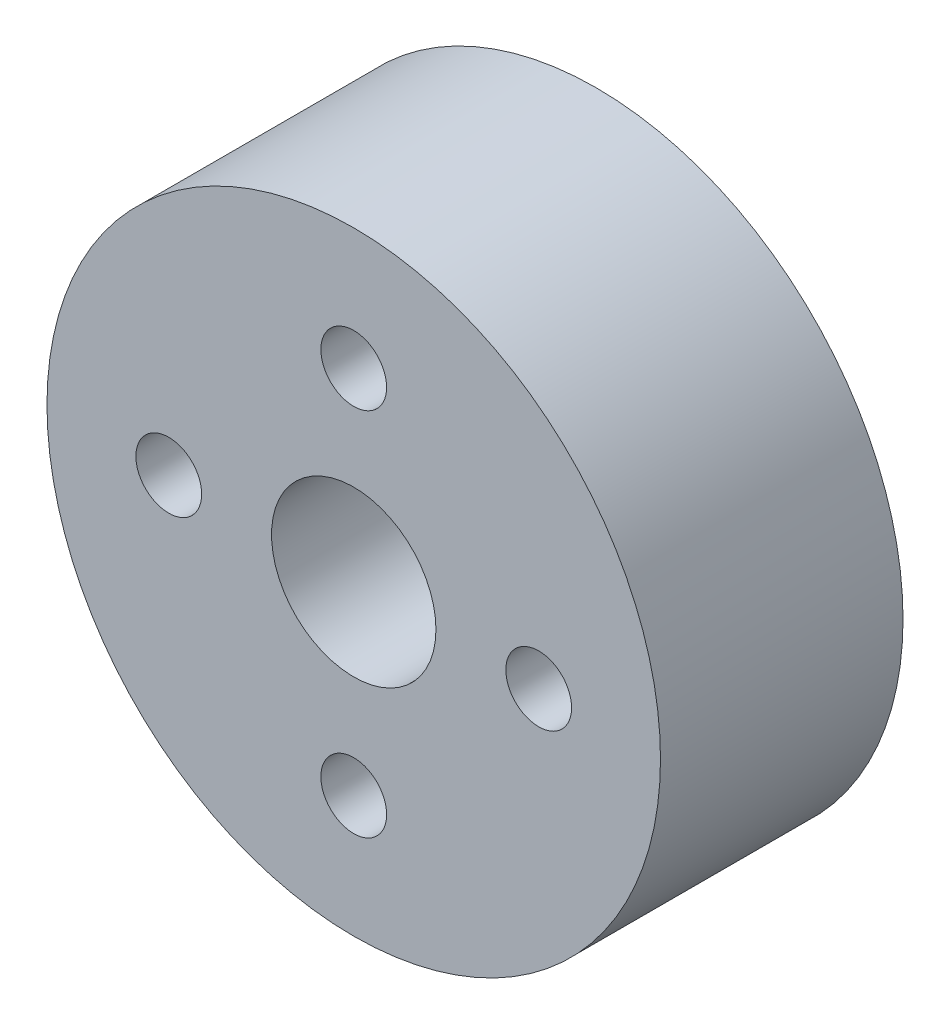
ISO-10303-21;
HEADER;
FILE_DESCRIPTION(('STEP AP214'),'2;1');
FILE_NAME('part.step','',(''),(''),'','','');
FILE_SCHEMA(('AUTOMOTIVE_DESIGN { 1 0 10303 214 1 1 1 1 }'));
ENDSEC;
DATA;
#1=APPLICATION_CONTEXT('core data for automotive mechanical design processes');
#2=APPLICATION_PROTOCOL_DEFINITION('international standard','automotive_design',2000,#1);
#3=PRODUCT_CONTEXT('',#1,'mechanical');
#4=PRODUCT('Part','Part','',(#3));
#5=PRODUCT_RELATED_PRODUCT_CATEGORY('part','',(#4));
#6=PRODUCT_DEFINITION_FORMATION('','',#4);
#7=PRODUCT_DEFINITION_CONTEXT('part definition',#1,'design');
#8=PRODUCT_DEFINITION('design','',#6,#7);
#9=PRODUCT_DEFINITION_SHAPE('','',#8);
#10=(LENGTH_UNIT() NAMED_UNIT(*) SI_UNIT(.MILLI.,.METRE.));
#11=(NAMED_UNIT(*) PLANE_ANGLE_UNIT() SI_UNIT($,.RADIAN.));
#12=(NAMED_UNIT(*) SI_UNIT($,.STERADIAN.) SOLID_ANGLE_UNIT());
#13=UNCERTAINTY_MEASURE_WITH_UNIT(LENGTH_MEASURE(1.E-05),#10,'distance_accuracy_value','');
#14=(GEOMETRIC_REPRESENTATION_CONTEXT(3) GLOBAL_UNCERTAINTY_ASSIGNED_CONTEXT((#13)) GLOBAL_UNIT_ASSIGNED_CONTEXT((#10,
#11,#12)) REPRESENTATION_CONTEXT('',''));
#15=CARTESIAN_POINT('',(0.,0.,0.));
#16=DIRECTION('',(0.,0.,1.));
#17=DIRECTION('',(1.,0.,0.));
#18=AXIS2_PLACEMENT_3D('',#15,#16,#17);
#19=CARTESIAN_POINT('',(0.,0.,11.8));
#20=DIRECTION('',(0.,0.,1.));
#21=DIRECTION('',(1.,0.,0.));
#22=AXIS2_PLACEMENT_3D('',#19,#20,#21);
#23=PLANE('',#22);
#24=CARTESIAN_POINT('',(0.,9.,11.8));
#25=DIRECTION('',(0.,0.,1.));
#26=DIRECTION('',(1.,0.,0.));
#27=AXIS2_PLACEMENT_3D('',#24,#25,#26);
#28=CIRCLE('',#27,1.6);
#29=CARTESIAN_POINT('',(1.6,9.,11.8));
#30=VERTEX_POINT('',#29);
#31=EDGE_CURVE('E67',#30,#30,#28,.T.);
#32=ORIENTED_EDGE('',*,*,#31,.F.);
#33=EDGE_LOOP('',(#32));
#34=FACE_BOUND('',#33,.T.);
#35=CARTESIAN_POINT('',(-9.,0.,11.8));
#36=DIRECTION('',(0.,0.,1.));
#37=DIRECTION('',(1.,0.,0.));
#38=AXIS2_PLACEMENT_3D('',#35,#36,#37);
#39=CIRCLE('',#38,1.6);
#40=CARTESIAN_POINT('',(-7.4,0.,11.8));
#41=VERTEX_POINT('',#40);
#42=EDGE_CURVE('E55',#41,#41,#39,.T.);
#43=ORIENTED_EDGE('',*,*,#42,.F.);
#44=EDGE_LOOP('',(#43));
#45=FACE_BOUND('',#44,.T.);
#46=CARTESIAN_POINT('',(0.,0.,11.8));
#47=DIRECTION('',(0.,0.,1.));
#48=DIRECTION('',(1.,0.,0.));
#49=AXIS2_PLACEMENT_3D('',#46,#47,#48);
#50=CIRCLE('',#49,14.925);
#51=CARTESIAN_POINT('',(14.925,0.,11.8));
#52=VERTEX_POINT('',#51);
#53=EDGE_CURVE('E10',#52,#52,#50,.T.);
#54=ORIENTED_EDGE('',*,*,#53,.T.);
#55=EDGE_LOOP('',(#54));
#56=FACE_BOUND('',#55,.T.);
#57=CARTESIAN_POINT('',(0.,0.,11.8));
#58=DIRECTION('',(0.,0.,1.));
#59=DIRECTION('',(1.,0.,0.));
#60=AXIS2_PLACEMENT_3D('',#57,#58,#59);
#61=CIRCLE('',#60,4.);
#62=CARTESIAN_POINT('',(4.,0.,11.8));
#63=VERTEX_POINT('',#62);
#64=EDGE_CURVE('E50',#63,#63,#61,.T.);
#65=ORIENTED_EDGE('',*,*,#64,.F.);
#66=EDGE_LOOP('',(#65));
#67=FACE_BOUND('',#66,.T.);
#68=CARTESIAN_POINT('',(9.,0.,11.8));
#69=DIRECTION('',(0.,0.,1.));
#70=DIRECTION('',(1.,0.,0.));
#71=AXIS2_PLACEMENT_3D('',#68,#69,#70);
#72=CIRCLE('',#71,1.6);
#73=CARTESIAN_POINT('',(10.6,0.,11.8));
#74=VERTEX_POINT('',#73);
#75=EDGE_CURVE('E61',#74,#74,#72,.T.);
#76=ORIENTED_EDGE('',*,*,#75,.F.);
#77=EDGE_LOOP('',(#76));
#78=FACE_BOUND('',#77,.T.);
#79=CARTESIAN_POINT('',(0.,-9.,11.8));
#80=DIRECTION('',(0.,0.,1.));
#81=DIRECTION('',(1.,0.,0.));
#82=AXIS2_PLACEMENT_3D('',#79,#80,#81);
#83=CIRCLE('',#82,1.6);
#84=CARTESIAN_POINT('',(1.6,-9.,11.8));
#85=VERTEX_POINT('',#84);
#86=EDGE_CURVE('E73',#85,#85,#83,.T.);
#87=ORIENTED_EDGE('',*,*,#86,.F.);
#88=EDGE_LOOP('',(#87));
#89=FACE_BOUND('',#88,.T.);
#90=ADVANCED_FACE('F39',(#34,#45,#56,#67,#78,#89),#23,.T.);
#91=CARTESIAN_POINT('',(0.,0.,0.));
#92=DIRECTION('',(0.,0.,1.));
#93=DIRECTION('',(1.,0.,0.));
#94=AXIS2_PLACEMENT_3D('',#91,#92,#93);
#95=PLANE('',#94);
#96=CARTESIAN_POINT('',(0.,0.,0.));
#97=DIRECTION('',(0.,0.,1.));
#98=DIRECTION('',(1.,0.,0.));
#99=AXIS2_PLACEMENT_3D('',#96,#97,#98);
#100=CIRCLE('',#99,14.925);
#101=CARTESIAN_POINT('',(14.925,0.,0.));
#102=VERTEX_POINT('',#101);
#103=EDGE_CURVE('E43',#102,#102,#100,.T.);
#104=ORIENTED_EDGE('',*,*,#103,.F.);
#105=EDGE_LOOP('',(#104));
#106=FACE_BOUND('',#105,.T.);
#107=CARTESIAN_POINT('',(0.,0.,0.));
#108=DIRECTION('',(0.,0.,1.));
#109=DIRECTION('',(1.,0.,0.));
#110=AXIS2_PLACEMENT_3D('',#107,#108,#109);
#111=CIRCLE('',#110,4.);
#112=CARTESIAN_POINT('',(4.,0.,0.));
#113=VERTEX_POINT('',#112);
#114=EDGE_CURVE('E52',#113,#113,#111,.T.);
#115=ORIENTED_EDGE('',*,*,#114,.T.);
#116=EDGE_LOOP('',(#115));
#117=FACE_BOUND('',#116,.T.);
#118=CARTESIAN_POINT('',(-9.,0.,0.));
#119=DIRECTION('',(0.,0.,1.));
#120=DIRECTION('',(1.,0.,0.));
#121=AXIS2_PLACEMENT_3D('',#118,#119,#120);
#122=CIRCLE('',#121,1.6);
#123=CARTESIAN_POINT('',(-7.4,0.,0.));
#124=VERTEX_POINT('',#123);
#125=EDGE_CURVE('E58',#124,#124,#122,.T.);
#126=ORIENTED_EDGE('',*,*,#125,.T.);
#127=EDGE_LOOP('',(#126));
#128=FACE_BOUND('',#127,.T.);
#129=CARTESIAN_POINT('',(9.,0.,0.));
#130=DIRECTION('',(0.,0.,1.));
#131=DIRECTION('',(1.,0.,0.));
#132=AXIS2_PLACEMENT_3D('',#129,#130,#131);
#133=CIRCLE('',#132,1.6);
#134=CARTESIAN_POINT('',(10.6,0.,0.));
#135=VERTEX_POINT('',#134);
#136=EDGE_CURVE('E64',#135,#135,#133,.T.);
#137=ORIENTED_EDGE('',*,*,#136,.T.);
#138=EDGE_LOOP('',(#137));
#139=FACE_BOUND('',#138,.T.);
#140=CARTESIAN_POINT('',(0.,9.,0.));
#141=DIRECTION('',(0.,0.,1.));
#142=DIRECTION('',(1.,0.,0.));
#143=AXIS2_PLACEMENT_3D('',#140,#141,#142);
#144=CIRCLE('',#143,1.6);
#145=CARTESIAN_POINT('',(1.6,9.,0.));
#146=VERTEX_POINT('',#145);
#147=EDGE_CURVE('E70',#146,#146,#144,.T.);
#148=ORIENTED_EDGE('',*,*,#147,.T.);
#149=EDGE_LOOP('',(#148));
#150=FACE_BOUND('',#149,.T.);
#151=CARTESIAN_POINT('',(0.,-9.,0.));
#152=DIRECTION('',(0.,0.,1.));
#153=DIRECTION('',(1.,0.,0.));
#154=AXIS2_PLACEMENT_3D('',#151,#152,#153);
#155=CIRCLE('',#154,1.6);
#156=CARTESIAN_POINT('',(1.6,-9.,0.));
#157=VERTEX_POINT('',#156);
#158=EDGE_CURVE('E76',#157,#157,#155,.T.);
#159=ORIENTED_EDGE('',*,*,#158,.T.);
#160=EDGE_LOOP('',(#159));
#161=FACE_BOUND('',#160,.T.);
#162=ADVANCED_FACE('F86',(#106,#117,#128,#139,#150,#161),#95,.F.);
#163=CARTESIAN_POINT('',(0.,0.,11.8));
#164=DIRECTION('',(0.,0.,-1.));
#165=DIRECTION('',(-1.,0.,0.));
#166=AXIS2_PLACEMENT_3D('',#163,#164,#165);
#167=CYLINDRICAL_SURFACE('',#166,14.925);
#168=ORIENTED_EDGE('',*,*,#53,.F.);
#169=EDGE_LOOP('',(#168));
#170=FACE_BOUND('',#169,.T.);
#171=ORIENTED_EDGE('',*,*,#103,.T.);
#172=EDGE_LOOP('',(#171));
#173=FACE_BOUND('',#172,.T.);
#174=ADVANCED_FACE('F41',(#170,#173),#167,.T.);
#175=CARTESIAN_POINT('',(0.,0.,11.8));
#176=DIRECTION('',(0.,0.,-1.));
#177=DIRECTION('',(-1.,0.,0.));
#178=AXIS2_PLACEMENT_3D('',#175,#176,#177);
#179=CYLINDRICAL_SURFACE('',#178,4.);
#180=ORIENTED_EDGE('',*,*,#64,.T.);
#181=EDGE_LOOP('',(#180));
#182=FACE_BOUND('',#181,.T.);
#183=ORIENTED_EDGE('',*,*,#114,.F.);
#184=EDGE_LOOP('',(#183));
#185=FACE_BOUND('',#184,.T.);
#186=ADVANCED_FACE('F96',(#182,#185),#179,.F.);
#187=CARTESIAN_POINT('',(-9.,0.,11.8));
#188=DIRECTION('',(0.,0.,-1.));
#189=DIRECTION('',(-1.,0.,0.));
#190=AXIS2_PLACEMENT_3D('',#187,#188,#189);
#191=CYLINDRICAL_SURFACE('',#190,1.6);
#192=ORIENTED_EDGE('',*,*,#42,.T.);
#193=EDGE_LOOP('',(#192));
#194=FACE_BOUND('',#193,.T.);
#195=ORIENTED_EDGE('',*,*,#125,.F.);
#196=EDGE_LOOP('',(#195));
#197=FACE_BOUND('',#196,.T.);
#198=ADVANCED_FACE('F99',(#194,#197),#191,.F.);
#199=CARTESIAN_POINT('',(9.,0.,11.8));
#200=DIRECTION('',(0.,0.,-1.));
#201=DIRECTION('',(-1.,0.,0.));
#202=AXIS2_PLACEMENT_3D('',#199,#200,#201);
#203=CYLINDRICAL_SURFACE('',#202,1.6);
#204=ORIENTED_EDGE('',*,*,#75,.T.);
#205=EDGE_LOOP('',(#204));
#206=FACE_BOUND('',#205,.T.);
#207=ORIENTED_EDGE('',*,*,#136,.F.);
#208=EDGE_LOOP('',(#207));
#209=FACE_BOUND('',#208,.T.);
#210=ADVANCED_FACE('F103',(#206,#209),#203,.F.);
#211=CARTESIAN_POINT('',(0.,9.,11.8));
#212=DIRECTION('',(0.,0.,-1.));
#213=DIRECTION('',(-1.,0.,0.));
#214=AXIS2_PLACEMENT_3D('',#211,#212,#213);
#215=CYLINDRICAL_SURFACE('',#214,1.6);
#216=ORIENTED_EDGE('',*,*,#31,.T.);
#217=EDGE_LOOP('',(#216));
#218=FACE_BOUND('',#217,.T.);
#219=ORIENTED_EDGE('',*,*,#147,.F.);
#220=EDGE_LOOP('',(#219));
#221=FACE_BOUND('',#220,.T.);
#222=ADVANCED_FACE('F107',(#218,#221),#215,.F.);
#223=CARTESIAN_POINT('',(0.,-9.,11.8));
#224=DIRECTION('',(0.,0.,-1.));
#225=DIRECTION('',(-1.,0.,0.));
#226=AXIS2_PLACEMENT_3D('',#223,#224,#225);
#227=CYLINDRICAL_SURFACE('',#226,1.6);
#228=ORIENTED_EDGE('',*,*,#86,.T.);
#229=EDGE_LOOP('',(#228));
#230=FACE_BOUND('',#229,.T.);
#231=ORIENTED_EDGE('',*,*,#158,.F.);
#232=EDGE_LOOP('',(#231));
#233=FACE_BOUND('',#232,.T.);
#234=ADVANCED_FACE('F82',(#230,#233),#227,.F.);
#235=CLOSED_SHELL('',(#90,#162,#174,#186,#198,#210,#222,#234));
#236=MANIFOLD_SOLID_BREP('B2',#235);
#237=ADVANCED_BREP_SHAPE_REPRESENTATION('',(#18,#236),#14);
#238=SHAPE_DEFINITION_REPRESENTATION(#9,#237);
ENDSEC;
END-ISO-10303-21;
